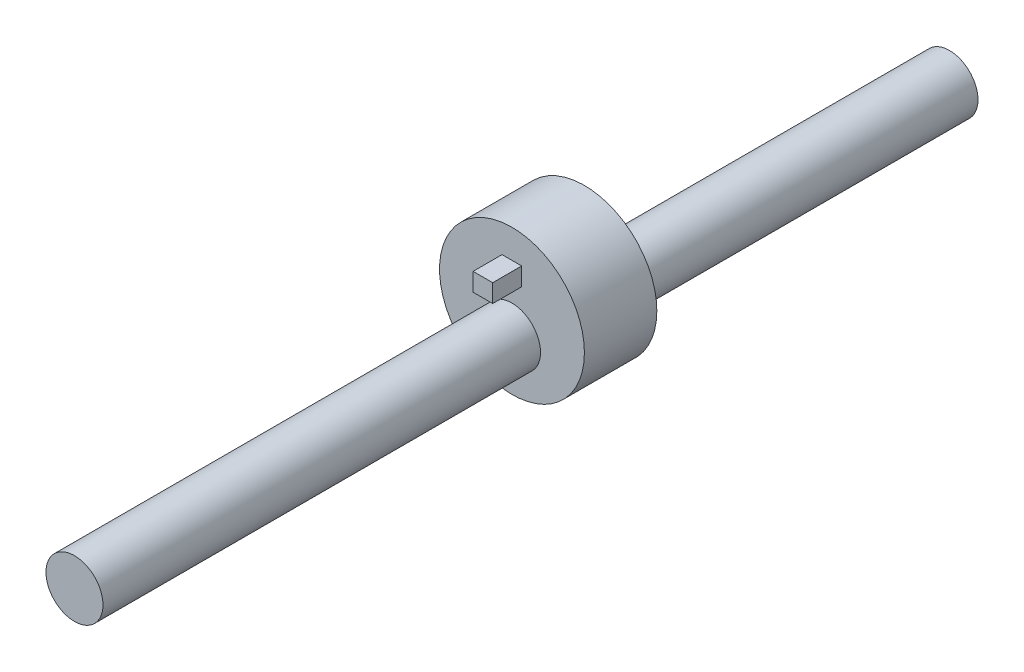
ISO-10303-21;
HEADER;
FILE_DESCRIPTION(('STEP AP214'),'2;1');
FILE_NAME('part.step','',(''),(''),'','','');
FILE_SCHEMA(('AUTOMOTIVE_DESIGN { 1 0 10303 214 1 1 1 1 }'));
ENDSEC;
DATA;
#1=APPLICATION_CONTEXT('core data for automotive mechanical design processes');
#2=APPLICATION_PROTOCOL_DEFINITION('international standard','automotive_design',2000,#1);
#3=PRODUCT_CONTEXT('',#1,'mechanical');
#4=PRODUCT('Part','Part','',(#3));
#5=PRODUCT_RELATED_PRODUCT_CATEGORY('part','',(#4));
#6=PRODUCT_DEFINITION_FORMATION('','',#4);
#7=PRODUCT_DEFINITION_CONTEXT('part definition',#1,'design');
#8=PRODUCT_DEFINITION('design','',#6,#7);
#9=PRODUCT_DEFINITION_SHAPE('','',#8);
#10=(LENGTH_UNIT() NAMED_UNIT(*) SI_UNIT(.MILLI.,.METRE.));
#11=(NAMED_UNIT(*) PLANE_ANGLE_UNIT() SI_UNIT($,.RADIAN.));
#12=(NAMED_UNIT(*) SI_UNIT($,.STERADIAN.) SOLID_ANGLE_UNIT());
#13=UNCERTAINTY_MEASURE_WITH_UNIT(LENGTH_MEASURE(1.E-05),#10,'distance_accuracy_value','');
#14=(GEOMETRIC_REPRESENTATION_CONTEXT(3) GLOBAL_UNCERTAINTY_ASSIGNED_CONTEXT((#13)) GLOBAL_UNIT_ASSIGNED_CONTEXT((#10,
#11,#12)) REPRESENTATION_CONTEXT('',''));
#15=CARTESIAN_POINT('',(0.,0.,0.));
#16=DIRECTION('',(0.,0.,1.));
#17=DIRECTION('',(1.,0.,0.));
#18=AXIS2_PLACEMENT_3D('',#15,#16,#17);
#19=CARTESIAN_POINT('',(0.,0.,6.35));
#20=DIRECTION('',(0.,0.,1.));
#21=DIRECTION('',(1.,0.,0.));
#22=AXIS2_PLACEMENT_3D('',#19,#20,#21);
#23=PLANE('',#22);
#24=CARTESIAN_POINT('',(0.,-1.905,6.35));
#25=DIRECTION('',(0.,0.,1.));
#26=DIRECTION('',(1.,0.,0.));
#27=AXIS2_PLACEMENT_3D('',#24,#25,#26);
#28=CIRCLE('',#27,2.499995);
#29=CARTESIAN_POINT('',(2.499995,-1.905,6.35));
#30=VERTEX_POINT('',#29);
#31=EDGE_CURVE('E121',#30,#30,#28,.F.);
#32=ORIENTED_EDGE('',*,*,#31,.T.);
#33=EDGE_LOOP('',(#32));
#34=FACE_BOUND('',#33,.T.);
#35=CARTESIAN_POINT('',(0.,0.,6.35));
#36=DIRECTION('',(0.,0.,1.));
#37=DIRECTION('',(1.,0.,0.));
#38=AXIS2_PLACEMENT_3D('',#35,#36,#37);
#39=CIRCLE('',#38,6.35);
#40=CARTESIAN_POINT('',(6.35,0.,6.35));
#41=VERTEX_POINT('',#40);
#42=EDGE_CURVE('E54',#41,#41,#39,.T.);
#43=ORIENTED_EDGE('',*,*,#42,.T.);
#44=EDGE_LOOP('',(#43));
#45=FACE_BOUND('',#44,.T.);
#46=DIRECTION('',(1.,0.,0.));
#47=VECTOR('',#46,1.);
#48=CARTESIAN_POINT('',(-0.869608633319308,2.25132012848223,6.35));
#49=LINE('',#48,#47);
#50=CARTESIAN_POINT('',(-0.869608633319308,2.25132012848223,6.35));
#51=VERTEX_POINT('',#50);
#52=CARTESIAN_POINT('',(0.850283997023322,2.25132012848223,6.35));
#53=VERTEX_POINT('',#52);
#54=EDGE_CURVE('E103',#51,#53,#49,.T.);
#55=ORIENTED_EDGE('',*,*,#54,.F.);
#56=DIRECTION('',(0.,-1.,0.));
#57=VECTOR('',#56,1.);
#58=CARTESIAN_POINT('',(-0.869608633319308,3.83594030475296,6.35));
#59=LINE('',#58,#57);
#60=CARTESIAN_POINT('',(-0.869608633319308,3.83594030475296,6.35));
#61=VERTEX_POINT('',#60);
#62=EDGE_CURVE('E117',#61,#51,#59,.T.);
#63=ORIENTED_EDGE('',*,*,#62,.F.);
#64=DIRECTION('',(-1.,0.,0.));
#65=VECTOR('',#64,1.);
#66=CARTESIAN_POINT('',(-0.869608633319308,3.83594030475296,6.35));
#67=LINE('',#66,#65);
#68=CARTESIAN_POINT('',(0.850283997023322,3.83594030475296,6.35));
#69=VERTEX_POINT('',#68);
#70=EDGE_CURVE('E83',#69,#61,#67,.T.);
#71=ORIENTED_EDGE('',*,*,#70,.F.);
#72=DIRECTION('',(0.,1.,0.));
#73=VECTOR('',#72,1.);
#74=CARTESIAN_POINT('',(0.850283997023322,3.83594030475296,6.35));
#75=LINE('',#74,#73);
#76=EDGE_CURVE('E124',#53,#69,#75,.T.);
#77=ORIENTED_EDGE('',*,*,#76,.F.);
#78=EDGE_LOOP('',(#55,#63,#71,#77));
#79=FACE_BOUND('',#78,.T.);
#80=ADVANCED_FACE('F45',(#34,#45,#79),#23,.T.);
#81=CARTESIAN_POINT('',(0.,0.,6.35));
#82=DIRECTION('',(0.,0.,-1.));
#83=DIRECTION('',(-1.,0.,0.));
#84=AXIS2_PLACEMENT_3D('',#81,#82,#83);
#85=CYLINDRICAL_SURFACE('',#84,6.35);
#86=ORIENTED_EDGE('',*,*,#42,.F.);
#87=EDGE_LOOP('',(#86));
#88=FACE_BOUND('',#87,.T.);
#89=CARTESIAN_POINT('',(0.,0.,0.));
#90=DIRECTION('',(0.,0.,1.));
#91=DIRECTION('',(1.,0.,0.));
#92=AXIS2_PLACEMENT_3D('',#89,#90,#91);
#93=CIRCLE('',#92,6.35);
#94=CARTESIAN_POINT('',(6.35,0.,0.));
#95=VERTEX_POINT('',#94);
#96=EDGE_CURVE('E135',#95,#95,#93,.T.);
#97=ORIENTED_EDGE('',*,*,#96,.T.);
#98=EDGE_LOOP('',(#97));
#99=FACE_BOUND('',#98,.T.);
#100=ADVANCED_FACE('F47',(#88,#99),#85,.T.);
#101=CARTESIAN_POINT('',(0.,0.,0.));
#102=DIRECTION('',(0.,0.,1.));
#103=DIRECTION('',(1.,0.,0.));
#104=AXIS2_PLACEMENT_3D('',#101,#102,#103);
#105=PLANE('',#104);
#106=CARTESIAN_POINT('',(0.,-1.905,0.));
#107=DIRECTION('',(0.,0.,1.));
#108=DIRECTION('',(1.,0.,0.));
#109=AXIS2_PLACEMENT_3D('',#106,#107,#108);
#110=CIRCLE('',#109,2.499995);
#111=CARTESIAN_POINT('',(2.499995,-1.905,0.));
#112=VERTEX_POINT('',#111);
#113=EDGE_CURVE('E11',#112,#112,#110,.F.);
#114=ORIENTED_EDGE('',*,*,#113,.F.);
#115=EDGE_LOOP('',(#114));
#116=FACE_BOUND('',#115,.T.);
#117=ORIENTED_EDGE('',*,*,#96,.F.);
#118=EDGE_LOOP('',(#117));
#119=FACE_BOUND('',#118,.T.);
#120=ADVANCED_FACE('F143',(#116,#119),#105,.F.);
#121=CARTESIAN_POINT('',(-0.869608633319308,3.83594030475296,8.89));
#122=DIRECTION('',(1.,0.,0.));
#123=DIRECTION('',(0.,0.,-1.));
#124=AXIS2_PLACEMENT_3D('',#121,#122,#123);
#125=PLANE('',#124);
#126=ORIENTED_EDGE('',*,*,#62,.T.);
#127=DIRECTION('',(0.,0.,-1.));
#128=VECTOR('',#127,1.);
#129=CARTESIAN_POINT('',(-0.869608633319308,2.25132012848223,8.89));
#130=LINE('',#129,#128);
#131=CARTESIAN_POINT('',(-0.869608633319308,2.25132012848223,8.89));
#132=VERTEX_POINT('',#131);
#133=EDGE_CURVE('E107',#132,#51,#130,.T.);
#134=ORIENTED_EDGE('',*,*,#133,.F.);
#135=DIRECTION('',(0.,-1.,0.));
#136=VECTOR('',#135,1.);
#137=CARTESIAN_POINT('',(-0.869608633319308,3.83594030475296,8.89));
#138=LINE('',#137,#136);
#139=CARTESIAN_POINT('',(-0.869608633319308,3.83594030475296,8.89));
#140=VERTEX_POINT('',#139);
#141=EDGE_CURVE('E95',#140,#132,#138,.T.);
#142=ORIENTED_EDGE('',*,*,#141,.F.);
#143=DIRECTION('',(0.,0.,-1.));
#144=VECTOR('',#143,1.);
#145=CARTESIAN_POINT('',(-0.869608633319308,3.83594030475296,8.89));
#146=LINE('',#145,#144);
#147=EDGE_CURVE('E113',#140,#61,#146,.T.);
#148=ORIENTED_EDGE('',*,*,#147,.T.);
#149=EDGE_LOOP('',(#126,#134,#142,#148));
#150=FACE_BOUND('',#149,.T.);
#151=ADVANCED_FACE('F145',(#150),#125,.F.);
#152=CARTESIAN_POINT('',(-0.869608633319308,2.25132012848223,8.89));
#153=DIRECTION('',(0.,1.,0.));
#154=DIRECTION('',(0.,0.,1.));
#155=AXIS2_PLACEMENT_3D('',#152,#153,#154);
#156=PLANE('',#155);
#157=ORIENTED_EDGE('',*,*,#54,.T.);
#158=DIRECTION('',(0.,0.,-1.));
#159=VECTOR('',#158,1.);
#160=CARTESIAN_POINT('',(0.850283997023322,2.25132012848223,8.89));
#161=LINE('',#160,#159);
#162=CARTESIAN_POINT('',(0.850283997023322,2.25132012848223,8.89));
#163=VERTEX_POINT('',#162);
#164=EDGE_CURVE('E100',#163,#53,#161,.T.);
#165=ORIENTED_EDGE('',*,*,#164,.F.);
#166=DIRECTION('',(1.,0.,0.));
#167=VECTOR('',#166,1.);
#168=CARTESIAN_POINT('',(-0.869608633319308,2.25132012848223,8.89));
#169=LINE('',#168,#167);
#170=EDGE_CURVE('E90',#132,#163,#169,.T.);
#171=ORIENTED_EDGE('',*,*,#170,.F.);
#172=ORIENTED_EDGE('',*,*,#133,.T.);
#173=EDGE_LOOP('',(#157,#165,#171,#172));
#174=FACE_BOUND('',#173,.T.);
#175=ADVANCED_FACE('F101',(#174),#156,.F.);
#176=CARTESIAN_POINT('',(0.850283997023322,3.83594030475296,8.89));
#177=DIRECTION('',(-1.,0.,0.));
#178=DIRECTION('',(0.,0.,1.));
#179=AXIS2_PLACEMENT_3D('',#176,#177,#178);
#180=PLANE('',#179);
#181=ORIENTED_EDGE('',*,*,#76,.T.);
#182=DIRECTION('',(0.,0.,-1.));
#183=VECTOR('',#182,1.);
#184=CARTESIAN_POINT('',(0.850283997023322,3.83594030475296,8.89));
#185=LINE('',#184,#183);
#186=CARTESIAN_POINT('',(0.850283997023322,3.83594030475296,8.89));
#187=VERTEX_POINT('',#186);
#188=EDGE_CURVE('E61',#187,#69,#185,.T.);
#189=ORIENTED_EDGE('',*,*,#188,.F.);
#190=DIRECTION('',(0.,1.,0.));
#191=VECTOR('',#190,1.);
#192=CARTESIAN_POINT('',(0.850283997023322,3.83594030475296,8.89));
#193=LINE('',#192,#191);
#194=EDGE_CURVE('E93',#163,#187,#193,.T.);
#195=ORIENTED_EDGE('',*,*,#194,.F.);
#196=ORIENTED_EDGE('',*,*,#164,.T.);
#197=EDGE_LOOP('',(#181,#189,#195,#196));
#198=FACE_BOUND('',#197,.T.);
#199=ADVANCED_FACE('F109',(#198),#180,.F.);
#200=CARTESIAN_POINT('',(-0.869608633319308,3.83594030475296,8.89));
#201=DIRECTION('',(0.,-1.,0.));
#202=DIRECTION('',(0.,0.,-1.));
#203=AXIS2_PLACEMENT_3D('',#200,#201,#202);
#204=PLANE('',#203);
#205=ORIENTED_EDGE('',*,*,#70,.T.);
#206=ORIENTED_EDGE('',*,*,#147,.F.);
#207=DIRECTION('',(-1.,0.,0.));
#208=VECTOR('',#207,1.);
#209=CARTESIAN_POINT('',(-0.869608633319308,3.83594030475296,8.89));
#210=LINE('',#209,#208);
#211=EDGE_CURVE('E69',#187,#140,#210,.T.);
#212=ORIENTED_EDGE('',*,*,#211,.F.);
#213=ORIENTED_EDGE('',*,*,#188,.T.);
#214=EDGE_LOOP('',(#205,#206,#212,#213));
#215=FACE_BOUND('',#214,.T.);
#216=ADVANCED_FACE('F169',(#215),#204,.F.);
#217=CARTESIAN_POINT('',(0.,0.,8.89));
#218=DIRECTION('',(0.,0.,1.));
#219=DIRECTION('',(1.,0.,0.));
#220=AXIS2_PLACEMENT_3D('',#217,#218,#219);
#221=PLANE('',#220);
#222=ORIENTED_EDGE('',*,*,#141,.T.);
#223=ORIENTED_EDGE('',*,*,#170,.T.);
#224=ORIENTED_EDGE('',*,*,#194,.T.);
#225=ORIENTED_EDGE('',*,*,#211,.T.);
#226=EDGE_LOOP('',(#222,#223,#224,#225));
#227=FACE_BOUND('',#226,.T.);
#228=ADVANCED_FACE('F91',(#227),#221,.T.);
#229=CARTESIAN_POINT('',(0.,-1.905,-32.004));
#230=DIRECTION('',(0.,0.,1.));
#231=DIRECTION('',(1.,0.,0.));
#232=AXIS2_PLACEMENT_3D('',#229,#230,#231);
#233=PLANE('',#232);
#234=CARTESIAN_POINT('',(0.,-1.905,-32.004));
#235=DIRECTION('',(0.,0.,1.));
#236=DIRECTION('',(1.,0.,0.));
#237=AXIS2_PLACEMENT_3D('',#234,#235,#236);
#238=CIRCLE('',#237,2.499995);
#239=CARTESIAN_POINT('',(2.499995,-1.905,-32.004));
#240=VERTEX_POINT('',#239);
#241=EDGE_CURVE('E191',#240,#240,#238,.T.);
#242=ORIENTED_EDGE('',*,*,#241,.F.);
#243=EDGE_LOOP('',(#242));
#244=FACE_BOUND('',#243,.T.);
#245=ADVANCED_FACE('F173',(#244),#233,.F.);
#246=CARTESIAN_POINT('',(0.,-1.905,44.704));
#247=DIRECTION('',(0.,0.,-1.));
#248=DIRECTION('',(-1.,0.,0.));
#249=AXIS2_PLACEMENT_3D('',#246,#247,#248);
#250=CYLINDRICAL_SURFACE('',#249,2.499995);
#251=ORIENTED_EDGE('',*,*,#241,.T.);
#252=EDGE_LOOP('',(#251));
#253=FACE_BOUND('',#252,.T.);
#254=ORIENTED_EDGE('',*,*,#113,.T.);
#255=EDGE_LOOP('',(#254));
#256=FACE_BOUND('',#255,.T.);
#257=ADVANCED_FACE('F178',(#253,#256),#250,.T.);
#258=ORIENTED_EDGE('',*,*,#31,.F.);
#259=EDGE_LOOP('',(#258));
#260=FACE_BOUND('',#259,.T.);
#261=CARTESIAN_POINT('',(0.,-1.905,44.704));
#262=DIRECTION('',(0.,0.,1.));
#263=DIRECTION('',(1.,0.,0.));
#264=AXIS2_PLACEMENT_3D('',#261,#262,#263);
#265=CIRCLE('',#264,2.499995);
#266=CARTESIAN_POINT('',(2.499995,-1.905,44.704));
#267=VERTEX_POINT('',#266);
#268=EDGE_CURVE('E188',#267,#267,#265,.T.);
#269=ORIENTED_EDGE('',*,*,#268,.F.);
#270=EDGE_LOOP('',(#269));
#271=FACE_BOUND('',#270,.T.);
#272=ADVANCED_FACE('F174',(#260,#271),#250,.T.);
#273=CARTESIAN_POINT('',(0.,-1.905,44.704));
#274=DIRECTION('',(0.,0.,1.));
#275=DIRECTION('',(1.,0.,0.));
#276=AXIS2_PLACEMENT_3D('',#273,#274,#275);
#277=PLANE('',#276);
#278=ORIENTED_EDGE('',*,*,#268,.T.);
#279=EDGE_LOOP('',(#278));
#280=FACE_BOUND('',#279,.T.);
#281=ADVANCED_FACE('F177',(#280),#277,.T.);
#282=CLOSED_SHELL('',(#80,#100,#120,#151,#175,#199,#216,#228,#245,#257,#272,#281));
#283=MANIFOLD_SOLID_BREP('B2',#282);
#284=ADVANCED_BREP_SHAPE_REPRESENTATION('',(#18,#283),#14);
#285=SHAPE_DEFINITION_REPRESENTATION(#9,#284);
ENDSEC;
END-ISO-10303-21;
